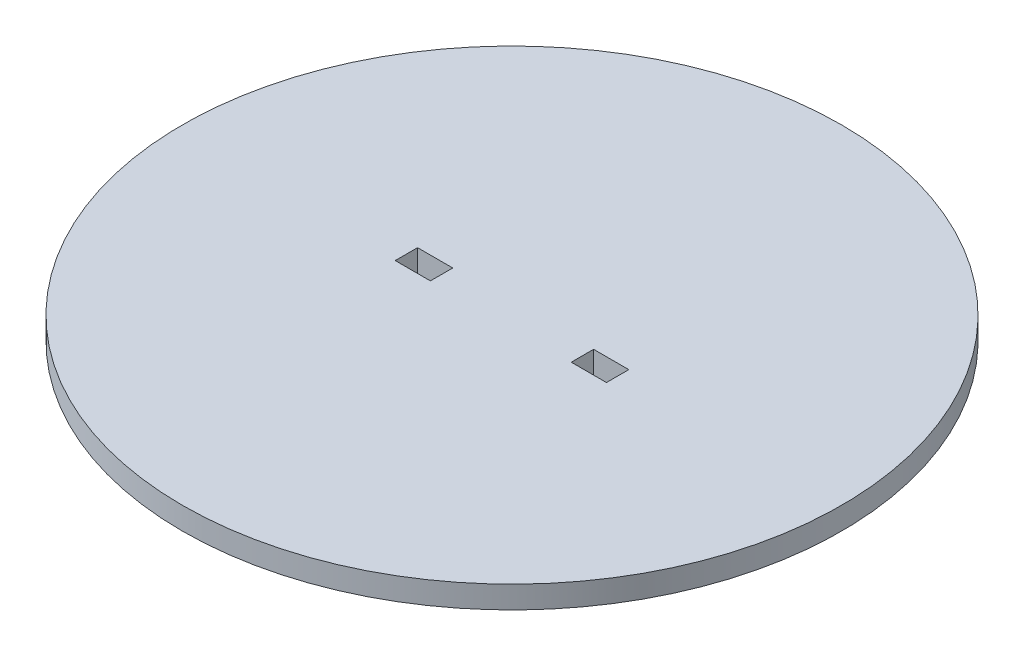
ISO-10303-21;
HEADER;
FILE_DESCRIPTION(('STEP AP214'),'2;1');
FILE_NAME('part.step','',(''),(''),'','','');
FILE_SCHEMA(('AUTOMOTIVE_DESIGN { 1 0 10303 214 1 1 1 1 }'));
ENDSEC;
DATA;
#1=APPLICATION_CONTEXT('core data for automotive mechanical design processes');
#2=APPLICATION_PROTOCOL_DEFINITION('international standard','automotive_design',2000,#1);
#3=PRODUCT_CONTEXT('',#1,'mechanical');
#4=PRODUCT('Part','Part','',(#3));
#5=PRODUCT_RELATED_PRODUCT_CATEGORY('part','',(#4));
#6=PRODUCT_DEFINITION_FORMATION('','',#4);
#7=PRODUCT_DEFINITION_CONTEXT('part definition',#1,'design');
#8=PRODUCT_DEFINITION('design','',#6,#7);
#9=PRODUCT_DEFINITION_SHAPE('','',#8);
#10=(LENGTH_UNIT() NAMED_UNIT(*) SI_UNIT(.MILLI.,.METRE.));
#11=(NAMED_UNIT(*) PLANE_ANGLE_UNIT() SI_UNIT($,.RADIAN.));
#12=(NAMED_UNIT(*) SI_UNIT($,.STERADIAN.) SOLID_ANGLE_UNIT());
#13=UNCERTAINTY_MEASURE_WITH_UNIT(LENGTH_MEASURE(1.E-05),#10,'distance_accuracy_value','');
#14=(GEOMETRIC_REPRESENTATION_CONTEXT(3) GLOBAL_UNCERTAINTY_ASSIGNED_CONTEXT((#13)) GLOBAL_UNIT_ASSIGNED_CONTEXT((#10,
#11,#12)) REPRESENTATION_CONTEXT('',''));
#15=CARTESIAN_POINT('',(0.,0.,0.));
#16=DIRECTION('',(0.,0.,1.));
#17=DIRECTION('',(1.,0.,0.));
#18=AXIS2_PLACEMENT_3D('',#15,#16,#17);
#19=CARTESIAN_POINT('',(0.,3.175,0.));
#20=DIRECTION('',(0.,1.,0.));
#21=DIRECTION('',(0.,0.,1.));
#22=AXIS2_PLACEMENT_3D('',#19,#20,#21);
#23=PLANE('',#22);
#24=DIRECTION('',(-1.,0.,0.));
#25=VECTOR('',#24,1.);
#26=CARTESIAN_POINT('',(-15.,3.175,-1.5875));
#27=LINE('',#26,#25);
#28=CARTESIAN_POINT('',(-10.,3.175,-1.5875));
#29=VERTEX_POINT('',#28);
#30=CARTESIAN_POINT('',(-15.,3.175,-1.5875));
#31=VERTEX_POINT('',#30);
#32=EDGE_CURVE('E136',#29,#31,#27,.T.);
#33=ORIENTED_EDGE('',*,*,#32,.F.);
#34=DIRECTION('',(0.,0.,-1.));
#35=VECTOR('',#34,1.);
#36=CARTESIAN_POINT('',(-10.,3.175,1.5875));
#37=LINE('',#36,#35);
#38=CARTESIAN_POINT('',(-10.,3.175,1.5875));
#39=VERTEX_POINT('',#38);
#40=EDGE_CURVE('E134',#39,#29,#37,.T.);
#41=ORIENTED_EDGE('',*,*,#40,.F.);
#42=DIRECTION('',(1.,0.,0.));
#43=VECTOR('',#42,1.);
#44=CARTESIAN_POINT('',(-15.,3.175,1.5875));
#45=LINE('',#44,#43);
#46=CARTESIAN_POINT('',(-15.,3.175,1.5875));
#47=VERTEX_POINT('',#46);
#48=EDGE_CURVE('E142',#47,#39,#45,.T.);
#49=ORIENTED_EDGE('',*,*,#48,.F.);
#50=DIRECTION('',(0.,0.,1.));
#51=VECTOR('',#50,1.);
#52=CARTESIAN_POINT('',(-15.,3.175,1.5875));
#53=LINE('',#52,#51);
#54=EDGE_CURVE('E139',#31,#47,#53,.T.);
#55=ORIENTED_EDGE('',*,*,#54,.F.);
#56=EDGE_LOOP('',(#33,#41,#49,#55));
#57=FACE_BOUND('',#56,.T.);
#58=CARTESIAN_POINT('',(0.,3.175,0.));
#59=DIRECTION('',(0.,1.,0.));
#60=DIRECTION('',(0.,0.,1.));
#61=AXIS2_PLACEMENT_3D('',#58,#59,#60);
#62=CIRCLE('',#61,46.8);
#63=CARTESIAN_POINT('',(0.,3.175,46.8));
#64=VERTEX_POINT('',#63);
#65=EDGE_CURVE('E11',#64,#64,#62,.T.);
#66=ORIENTED_EDGE('',*,*,#65,.T.);
#67=EDGE_LOOP('',(#66));
#68=FACE_BOUND('',#67,.T.);
#69=DIRECTION('',(-1.,0.,0.));
#70=VECTOR('',#69,1.);
#71=CARTESIAN_POINT('',(10.,3.175,-1.5875));
#72=LINE('',#71,#70);
#73=CARTESIAN_POINT('',(15.,3.175,-1.5875));
#74=VERTEX_POINT('',#73);
#75=CARTESIAN_POINT('',(10.,3.175,-1.5875));
#76=VERTEX_POINT('',#75);
#77=EDGE_CURVE('E106',#74,#76,#72,.T.);
#78=ORIENTED_EDGE('',*,*,#77,.F.);
#79=DIRECTION('',(0.,0.,-1.));
#80=VECTOR('',#79,1.);
#81=CARTESIAN_POINT('',(15.,3.175,1.5875));
#82=LINE('',#81,#80);
#83=CARTESIAN_POINT('',(15.,3.175,1.5875));
#84=VERTEX_POINT('',#83);
#85=EDGE_CURVE('E98',#84,#74,#82,.T.);
#86=ORIENTED_EDGE('',*,*,#85,.F.);
#87=DIRECTION('',(1.,0.,0.));
#88=VECTOR('',#87,1.);
#89=CARTESIAN_POINT('',(10.,3.175,1.5875));
#90=LINE('',#89,#88);
#91=CARTESIAN_POINT('',(10.,3.175,1.5875));
#92=VERTEX_POINT('',#91);
#93=EDGE_CURVE('E120',#92,#84,#90,.T.);
#94=ORIENTED_EDGE('',*,*,#93,.F.);
#95=DIRECTION('',(0.,0.,1.));
#96=VECTOR('',#95,1.);
#97=CARTESIAN_POINT('',(10.,3.175,1.5875));
#98=LINE('',#97,#96);
#99=EDGE_CURVE('E118',#76,#92,#98,.T.);
#100=ORIENTED_EDGE('',*,*,#99,.F.);
#101=EDGE_LOOP('',(#78,#86,#94,#100));
#102=FACE_BOUND('',#101,.T.);
#103=ADVANCED_FACE('F33',(#57,#68,#102),#23,.T.);
#104=CARTESIAN_POINT('',(0.,0.,0.));
#105=DIRECTION('',(0.,1.,0.));
#106=DIRECTION('',(0.,0.,1.));
#107=AXIS2_PLACEMENT_3D('',#104,#105,#106);
#108=PLANE('',#107);
#109=DIRECTION('',(0.,0.,-1.));
#110=VECTOR('',#109,1.);
#111=CARTESIAN_POINT('',(-10.,0.,1.5875));
#112=LINE('',#111,#110);
#113=CARTESIAN_POINT('',(-10.,0.,1.5875));
#114=VERTEX_POINT('',#113);
#115=CARTESIAN_POINT('',(-10.,0.,-1.5875));
#116=VERTEX_POINT('',#115);
#117=EDGE_CURVE('E114',#114,#116,#112,.T.);
#118=ORIENTED_EDGE('',*,*,#117,.T.);
#119=DIRECTION('',(-1.,0.,0.));
#120=VECTOR('',#119,1.);
#121=CARTESIAN_POINT('',(-15.,0.,-1.5875));
#122=LINE('',#121,#120);
#123=CARTESIAN_POINT('',(-15.,0.,-1.5875));
#124=VERTEX_POINT('',#123);
#125=EDGE_CURVE('E147',#116,#124,#122,.T.);
#126=ORIENTED_EDGE('',*,*,#125,.T.);
#127=DIRECTION('',(0.,0.,1.));
#128=VECTOR('',#127,1.);
#129=CARTESIAN_POINT('',(-15.,0.,1.5875));
#130=LINE('',#129,#128);
#131=CARTESIAN_POINT('',(-15.,0.,1.5875));
#132=VERTEX_POINT('',#131);
#133=EDGE_CURVE('E150',#124,#132,#130,.T.);
#134=ORIENTED_EDGE('',*,*,#133,.T.);
#135=DIRECTION('',(1.,0.,0.));
#136=VECTOR('',#135,1.);
#137=CARTESIAN_POINT('',(-15.,0.,1.5875));
#138=LINE('',#137,#136);
#139=EDGE_CURVE('E137',#132,#114,#138,.T.);
#140=ORIENTED_EDGE('',*,*,#139,.T.);
#141=EDGE_LOOP('',(#118,#126,#134,#140));
#142=FACE_BOUND('',#141,.T.);
#143=CARTESIAN_POINT('',(0.,0.,0.));
#144=DIRECTION('',(0.,1.,0.));
#145=DIRECTION('',(0.,0.,1.));
#146=AXIS2_PLACEMENT_3D('',#143,#144,#145);
#147=CIRCLE('',#146,46.8);
#148=CARTESIAN_POINT('',(0.,0.,46.8));
#149=VERTEX_POINT('',#148);
#150=EDGE_CURVE('E37',#149,#149,#147,.T.);
#151=ORIENTED_EDGE('',*,*,#150,.F.);
#152=EDGE_LOOP('',(#151));
#153=FACE_BOUND('',#152,.T.);
#154=DIRECTION('',(0.,0.,-1.));
#155=VECTOR('',#154,1.);
#156=CARTESIAN_POINT('',(15.,0.,1.5875));
#157=LINE('',#156,#155);
#158=CARTESIAN_POINT('',(15.,0.,1.5875));
#159=VERTEX_POINT('',#158);
#160=CARTESIAN_POINT('',(15.,0.,-1.5875));
#161=VERTEX_POINT('',#160);
#162=EDGE_CURVE('E56',#159,#161,#157,.T.);
#163=ORIENTED_EDGE('',*,*,#162,.T.);
#164=DIRECTION('',(-1.,0.,0.));
#165=VECTOR('',#164,1.);
#166=CARTESIAN_POINT('',(10.,0.,-1.5875));
#167=LINE('',#166,#165);
#168=CARTESIAN_POINT('',(10.,0.,-1.5875));
#169=VERTEX_POINT('',#168);
#170=EDGE_CURVE('E113',#161,#169,#167,.T.);
#171=ORIENTED_EDGE('',*,*,#170,.T.);
#172=DIRECTION('',(0.,0.,1.));
#173=VECTOR('',#172,1.);
#174=CARTESIAN_POINT('',(10.,0.,1.5875));
#175=LINE('',#174,#173);
#176=CARTESIAN_POINT('',(10.,0.,1.5875));
#177=VERTEX_POINT('',#176);
#178=EDGE_CURVE('E126',#169,#177,#175,.T.);
#179=ORIENTED_EDGE('',*,*,#178,.T.);
#180=DIRECTION('',(1.,0.,0.));
#181=VECTOR('',#180,1.);
#182=CARTESIAN_POINT('',(10.,0.,1.5875));
#183=LINE('',#182,#181);
#184=EDGE_CURVE('E107',#177,#159,#183,.T.);
#185=ORIENTED_EDGE('',*,*,#184,.T.);
#186=EDGE_LOOP('',(#163,#171,#179,#185));
#187=FACE_BOUND('',#186,.T.);
#188=ADVANCED_FACE('F169',(#142,#153,#187),#108,.F.);
#189=CARTESIAN_POINT('',(0.,3.175,0.));
#190=DIRECTION('',(0.,-1.,0.));
#191=DIRECTION('',(0.,0.,-1.));
#192=AXIS2_PLACEMENT_3D('',#189,#190,#191);
#193=CYLINDRICAL_SURFACE('',#192,46.8);
#194=ORIENTED_EDGE('',*,*,#65,.F.);
#195=EDGE_LOOP('',(#194));
#196=FACE_BOUND('',#195,.T.);
#197=ORIENTED_EDGE('',*,*,#150,.T.);
#198=EDGE_LOOP('',(#197));
#199=FACE_BOUND('',#198,.T.);
#200=ADVANCED_FACE('F35',(#196,#199),#193,.T.);
#201=CARTESIAN_POINT('',(-10.,3.175,1.5875));
#202=DIRECTION('',(-1.,0.,0.));
#203=DIRECTION('',(0.,0.,1.));
#204=AXIS2_PLACEMENT_3D('',#201,#202,#203);
#205=PLANE('',#204);
#206=ORIENTED_EDGE('',*,*,#117,.F.);
#207=DIRECTION('',(0.,-1.,0.));
#208=VECTOR('',#207,1.);
#209=CARTESIAN_POINT('',(-10.,3.175,1.5875));
#210=LINE('',#209,#208);
#211=EDGE_CURVE('E144',#39,#114,#210,.T.);
#212=ORIENTED_EDGE('',*,*,#211,.F.);
#213=ORIENTED_EDGE('',*,*,#40,.T.);
#214=DIRECTION('',(0.,-1.,0.));
#215=VECTOR('',#214,1.);
#216=CARTESIAN_POINT('',(-10.,3.175,-1.5875));
#217=LINE('',#216,#215);
#218=EDGE_CURVE('E161',#29,#116,#217,.T.);
#219=ORIENTED_EDGE('',*,*,#218,.T.);
#220=EDGE_LOOP('',(#206,#212,#213,#219));
#221=FACE_BOUND('',#220,.T.);
#222=ADVANCED_FACE('F191',(#221),#205,.T.);
#223=CARTESIAN_POINT('',(-15.,3.175,-1.5875));
#224=DIRECTION('',(0.,0.,1.));
#225=DIRECTION('',(1.,0.,0.));
#226=AXIS2_PLACEMENT_3D('',#223,#224,#225);
#227=PLANE('',#226);
#228=ORIENTED_EDGE('',*,*,#125,.F.);
#229=ORIENTED_EDGE('',*,*,#218,.F.);
#230=ORIENTED_EDGE('',*,*,#32,.T.);
#231=DIRECTION('',(0.,-1.,0.));
#232=VECTOR('',#231,1.);
#233=CARTESIAN_POINT('',(-15.,3.175,-1.5875));
#234=LINE('',#233,#232);
#235=EDGE_CURVE('E159',#31,#124,#234,.T.);
#236=ORIENTED_EDGE('',*,*,#235,.T.);
#237=EDGE_LOOP('',(#228,#229,#230,#236));
#238=FACE_BOUND('',#237,.T.);
#239=ADVANCED_FACE('F194',(#238),#227,.T.);
#240=CARTESIAN_POINT('',(-15.,3.175,1.5875));
#241=DIRECTION('',(1.,0.,0.));
#242=DIRECTION('',(0.,0.,-1.));
#243=AXIS2_PLACEMENT_3D('',#240,#241,#242);
#244=PLANE('',#243);
#245=ORIENTED_EDGE('',*,*,#133,.F.);
#246=ORIENTED_EDGE('',*,*,#235,.F.);
#247=ORIENTED_EDGE('',*,*,#54,.T.);
#248=DIRECTION('',(0.,-1.,0.));
#249=VECTOR('',#248,1.);
#250=CARTESIAN_POINT('',(-15.,3.175,1.5875));
#251=LINE('',#250,#249);
#252=EDGE_CURVE('E157',#47,#132,#251,.T.);
#253=ORIENTED_EDGE('',*,*,#252,.T.);
#254=EDGE_LOOP('',(#245,#246,#247,#253));
#255=FACE_BOUND('',#254,.T.);
#256=ADVANCED_FACE('F197',(#255),#244,.T.);
#257=CARTESIAN_POINT('',(-15.,3.175,1.5875));
#258=DIRECTION('',(0.,0.,-1.));
#259=DIRECTION('',(-1.,0.,0.));
#260=AXIS2_PLACEMENT_3D('',#257,#258,#259);
#261=PLANE('',#260);
#262=ORIENTED_EDGE('',*,*,#139,.F.);
#263=ORIENTED_EDGE('',*,*,#252,.F.);
#264=ORIENTED_EDGE('',*,*,#48,.T.);
#265=ORIENTED_EDGE('',*,*,#211,.T.);
#266=EDGE_LOOP('',(#262,#263,#264,#265));
#267=FACE_BOUND('',#266,.T.);
#268=ADVANCED_FACE('F201',(#267),#261,.T.);
#269=CARTESIAN_POINT('',(15.,3.175,1.5875));
#270=DIRECTION('',(-1.,0.,0.));
#271=DIRECTION('',(0.,0.,1.));
#272=AXIS2_PLACEMENT_3D('',#269,#270,#271);
#273=PLANE('',#272);
#274=ORIENTED_EDGE('',*,*,#162,.F.);
#275=DIRECTION('',(0.,-1.,0.));
#276=VECTOR('',#275,1.);
#277=CARTESIAN_POINT('',(15.,3.175,1.5875));
#278=LINE('',#277,#276);
#279=EDGE_CURVE('E102',#84,#159,#278,.T.);
#280=ORIENTED_EDGE('',*,*,#279,.F.);
#281=ORIENTED_EDGE('',*,*,#85,.T.);
#282=DIRECTION('',(0.,-1.,0.));
#283=VECTOR('',#282,1.);
#284=CARTESIAN_POINT('',(15.,3.175,-1.5875));
#285=LINE('',#284,#283);
#286=EDGE_CURVE('E101',#74,#161,#285,.T.);
#287=ORIENTED_EDGE('',*,*,#286,.T.);
#288=EDGE_LOOP('',(#274,#280,#281,#287));
#289=FACE_BOUND('',#288,.T.);
#290=ADVANCED_FACE('F100',(#289),#273,.T.);
#291=CARTESIAN_POINT('',(10.,3.175,-1.5875));
#292=DIRECTION('',(0.,0.,1.));
#293=DIRECTION('',(1.,0.,0.));
#294=AXIS2_PLACEMENT_3D('',#291,#292,#293);
#295=PLANE('',#294);
#296=ORIENTED_EDGE('',*,*,#170,.F.);
#297=ORIENTED_EDGE('',*,*,#286,.F.);
#298=ORIENTED_EDGE('',*,*,#77,.T.);
#299=DIRECTION('',(0.,-1.,0.));
#300=VECTOR('',#299,1.);
#301=CARTESIAN_POINT('',(10.,3.175,-1.5875));
#302=LINE('',#301,#300);
#303=EDGE_CURVE('E115',#76,#169,#302,.T.);
#304=ORIENTED_EDGE('',*,*,#303,.T.);
#305=EDGE_LOOP('',(#296,#297,#298,#304));
#306=FACE_BOUND('',#305,.T.);
#307=ADVANCED_FACE('F110',(#306),#295,.T.);
#308=CARTESIAN_POINT('',(10.,3.175,1.5875));
#309=DIRECTION('',(1.,0.,0.));
#310=DIRECTION('',(0.,0.,-1.));
#311=AXIS2_PLACEMENT_3D('',#308,#309,#310);
#312=PLANE('',#311);
#313=ORIENTED_EDGE('',*,*,#178,.F.);
#314=ORIENTED_EDGE('',*,*,#303,.F.);
#315=ORIENTED_EDGE('',*,*,#99,.T.);
#316=DIRECTION('',(0.,-1.,0.));
#317=VECTOR('',#316,1.);
#318=CARTESIAN_POINT('',(10.,3.175,1.5875));
#319=LINE('',#318,#317);
#320=EDGE_CURVE('E48',#92,#177,#319,.T.);
#321=ORIENTED_EDGE('',*,*,#320,.T.);
#322=EDGE_LOOP('',(#313,#314,#315,#321));
#323=FACE_BOUND('',#322,.T.);
#324=ADVANCED_FACE('F176',(#323),#312,.T.);
#325=CARTESIAN_POINT('',(10.,3.175,1.5875));
#326=DIRECTION('',(0.,0.,-1.));
#327=DIRECTION('',(-1.,0.,0.));
#328=AXIS2_PLACEMENT_3D('',#325,#326,#327);
#329=PLANE('',#328);
#330=ORIENTED_EDGE('',*,*,#184,.F.);
#331=ORIENTED_EDGE('',*,*,#320,.F.);
#332=ORIENTED_EDGE('',*,*,#93,.T.);
#333=ORIENTED_EDGE('',*,*,#279,.T.);
#334=EDGE_LOOP('',(#330,#331,#332,#333));
#335=FACE_BOUND('',#334,.T.);
#336=ADVANCED_FACE('F174',(#335),#329,.T.);
#337=CLOSED_SHELL('',(#103,#188,#200,#222,#239,#256,#268,#290,#307,#324,#336));
#338=MANIFOLD_SOLID_BREP('B2',#337);
#339=ADVANCED_BREP_SHAPE_REPRESENTATION('',(#18,#338),#14);
#340=SHAPE_DEFINITION_REPRESENTATION(#9,#339);
ENDSEC;
END-ISO-10303-21;
